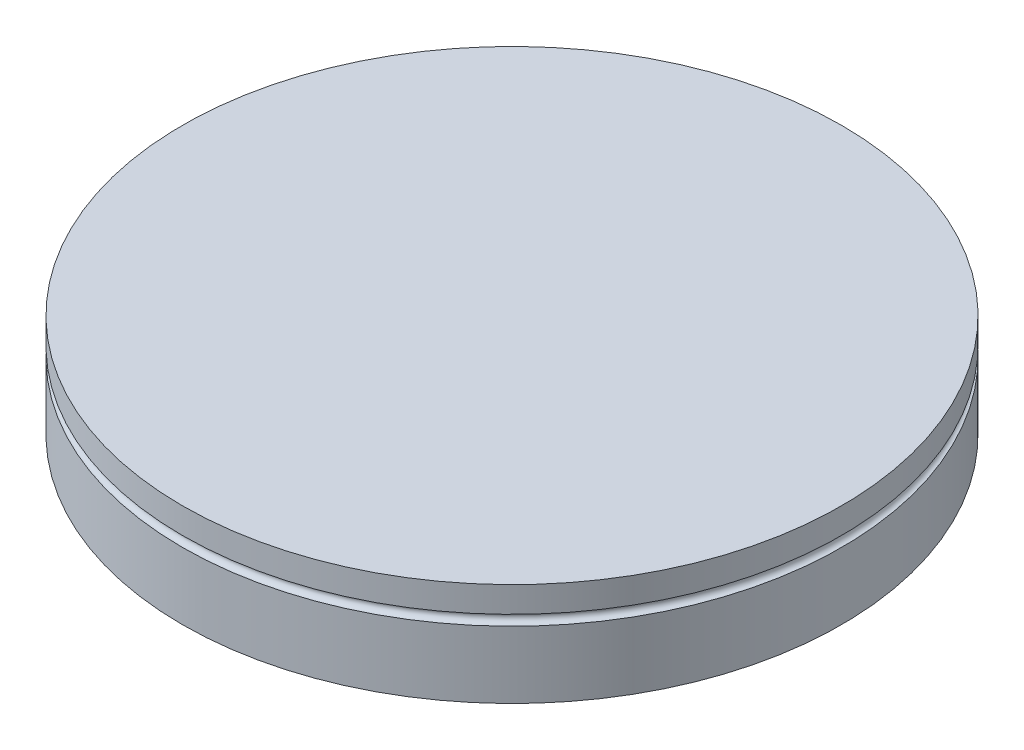
ISO-10303-21;
HEADER;
FILE_DESCRIPTION(('STEP AP214'),'2;1');
FILE_NAME('part.step','',(''),(''),'','','');
FILE_SCHEMA(('AUTOMOTIVE_DESIGN { 1 0 10303 214 1 1 1 1 }'));
ENDSEC;
DATA;
#1=APPLICATION_CONTEXT('core data for automotive mechanical design processes');
#2=APPLICATION_PROTOCOL_DEFINITION('international standard','automotive_design',2000,#1);
#3=PRODUCT_CONTEXT('',#1,'mechanical');
#4=PRODUCT('Part','Part','',(#3));
#5=PRODUCT_RELATED_PRODUCT_CATEGORY('part','',(#4));
#6=PRODUCT_DEFINITION_FORMATION('','',#4);
#7=PRODUCT_DEFINITION_CONTEXT('part definition',#1,'design');
#8=PRODUCT_DEFINITION('design','',#6,#7);
#9=PRODUCT_DEFINITION_SHAPE('','',#8);
#10=(LENGTH_UNIT() NAMED_UNIT(*) SI_UNIT(.MILLI.,.METRE.));
#11=(NAMED_UNIT(*) PLANE_ANGLE_UNIT() SI_UNIT($,.RADIAN.));
#12=(NAMED_UNIT(*) SI_UNIT($,.STERADIAN.) SOLID_ANGLE_UNIT());
#13=UNCERTAINTY_MEASURE_WITH_UNIT(LENGTH_MEASURE(1.E-05),#10,'distance_accuracy_value','');
#14=(GEOMETRIC_REPRESENTATION_CONTEXT(3) GLOBAL_UNCERTAINTY_ASSIGNED_CONTEXT((#13)) GLOBAL_UNIT_ASSIGNED_CONTEXT((#10,
#11,#12)) REPRESENTATION_CONTEXT('',''));
#15=CARTESIAN_POINT('',(0.,0.,0.));
#16=DIRECTION('',(0.,0.,1.));
#17=DIRECTION('',(1.,0.,0.));
#18=AXIS2_PLACEMENT_3D('',#15,#16,#17);
#19=CARTESIAN_POINT('',(0.,20.,0.));
#20=DIRECTION('',(0.,-1.,0.));
#21=DIRECTION('',(0.,0.,-1.));
#22=AXIS2_PLACEMENT_3D('',#19,#20,#21);
#23=CYLINDRICAL_SURFACE('',#22,64.);
#24=CARTESIAN_POINT('',(0.,20.,0.));
#25=DIRECTION('',(0.,1.,0.));
#26=DIRECTION('',(0.,0.,1.));
#27=AXIS2_PLACEMENT_3D('',#24,#25,#26);
#28=CIRCLE('',#27,64.);
#29=CARTESIAN_POINT('',(0.,20.,64.));
#30=VERTEX_POINT('',#29);
#31=EDGE_CURVE('E10',#30,#30,#28,.T.);
#32=ORIENTED_EDGE('',*,*,#31,.F.);
#33=EDGE_LOOP('',(#32));
#34=FACE_BOUND('',#33,.T.);
#35=CARTESIAN_POINT('',(0.,15.,0.));
#36=DIRECTION('',(0.,-1.,0.));
#37=DIRECTION('',(0.,0.,-1.));
#38=AXIS2_PLACEMENT_3D('',#35,#36,#37);
#39=CIRCLE('',#38,64.);
#40=CARTESIAN_POINT('',(0.,15.,-64.));
#41=VERTEX_POINT('',#40);
#42=EDGE_CURVE('E46',#41,#41,#39,.T.);
#43=ORIENTED_EDGE('',*,*,#42,.F.);
#44=EDGE_LOOP('',(#43));
#45=FACE_BOUND('',#44,.T.);
#46=ADVANCED_FACE('F43',(#34,#45),#23,.T.);
#47=CARTESIAN_POINT('',(0.,20.,0.));
#48=DIRECTION('',(0.,1.,0.));
#49=DIRECTION('',(0.,0.,1.));
#50=AXIS2_PLACEMENT_3D('',#47,#48,#49);
#51=PLANE('',#50);
#52=ORIENTED_EDGE('',*,*,#31,.T.);
#53=EDGE_LOOP('',(#52));
#54=FACE_BOUND('',#53,.T.);
#55=ADVANCED_FACE('F66',(#54),#51,.T.);
#56=CARTESIAN_POINT('',(0.,14.,0.));
#57=DIRECTION('',(0.,1.,0.));
#58=DIRECTION('',(0.,0.,1.));
#59=AXIS2_PLACEMENT_3D('',#56,#57,#58);
#60=TOROIDAL_SURFACE('',#59,64.,0.999999999999998);
#61=CARTESIAN_POINT('',(0.,13.,0.));
#62=DIRECTION('',(0.,1.,0.));
#63=DIRECTION('',(0.,0.,1.));
#64=AXIS2_PLACEMENT_3D('',#61,#62,#63);
#65=CIRCLE('',#64,64.);
#66=CARTESIAN_POINT('',(0.,13.,64.));
#67=VERTEX_POINT('',#66);
#68=EDGE_CURVE('E56',#67,#67,#65,.T.);
#69=ORIENTED_EDGE('',*,*,#68,.T.);
#70=EDGE_LOOP('',(#69));
#71=FACE_BOUND('',#70,.T.);
#72=ORIENTED_EDGE('',*,*,#42,.T.);
#73=EDGE_LOOP('',(#72));
#74=FACE_BOUND('',#73,.T.);
#75=ADVANCED_FACE('F63',(#71,#74),#60,.F.);
#76=CARTESIAN_POINT('',(0.,0.,0.));
#77=DIRECTION('',(0.,1.,0.));
#78=DIRECTION('',(0.,0.,1.));
#79=AXIS2_PLACEMENT_3D('',#76,#77,#78);
#80=PLANE('',#79);
#81=CARTESIAN_POINT('',(0.,0.,0.));
#82=DIRECTION('',(0.,1.,0.));
#83=DIRECTION('',(0.,0.,1.));
#84=AXIS2_PLACEMENT_3D('',#81,#82,#83);
#85=CIRCLE('',#84,64.);
#86=CARTESIAN_POINT('',(0.,0.,64.));
#87=VERTEX_POINT('',#86);
#88=EDGE_CURVE('E50',#87,#87,#85,.T.);
#89=ORIENTED_EDGE('',*,*,#88,.F.);
#90=EDGE_LOOP('',(#89));
#91=FACE_BOUND('',#90,.T.);
#92=ADVANCED_FACE('F76',(#91),#80,.F.);
#93=ORIENTED_EDGE('',*,*,#88,.T.);
#94=EDGE_LOOP('',(#93));
#95=FACE_BOUND('',#94,.T.);
#96=ORIENTED_EDGE('',*,*,#68,.F.);
#97=EDGE_LOOP('',(#96));
#98=FACE_BOUND('',#97,.T.);
#99=ADVANCED_FACE('F68',(#95,#98),#23,.T.);
#100=CLOSED_SHELL('',(#46,#55,#75,#92,#99));
#101=MANIFOLD_SOLID_BREP('B2',#100);
#102=ADVANCED_BREP_SHAPE_REPRESENTATION('',(#18,#101),#14);
#103=SHAPE_DEFINITION_REPRESENTATION(#9,#102);
ENDSEC;
END-ISO-10303-21;
